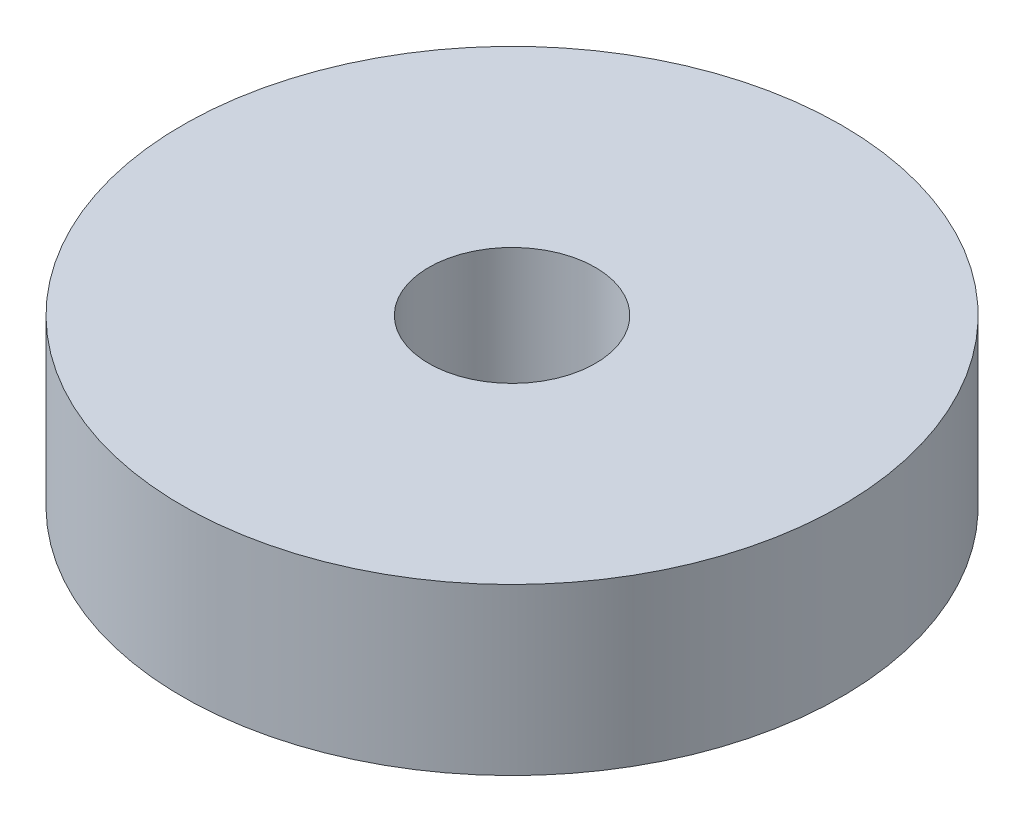
ISO-10303-21;
HEADER;
FILE_DESCRIPTION(('STEP AP214'),'2;1');
FILE_NAME('part.step','',(''),(''),'','','');
FILE_SCHEMA(('AUTOMOTIVE_DESIGN { 1 0 10303 214 1 1 1 1 }'));
ENDSEC;
DATA;
#1=APPLICATION_CONTEXT('core data for automotive mechanical design processes');
#2=APPLICATION_PROTOCOL_DEFINITION('international standard','automotive_design',2000,#1);
#3=PRODUCT_CONTEXT('',#1,'mechanical');
#4=PRODUCT('Part','Part','',(#3));
#5=PRODUCT_RELATED_PRODUCT_CATEGORY('part','',(#4));
#6=PRODUCT_DEFINITION_FORMATION('','',#4);
#7=PRODUCT_DEFINITION_CONTEXT('part definition',#1,'design');
#8=PRODUCT_DEFINITION('design','',#6,#7);
#9=PRODUCT_DEFINITION_SHAPE('','',#8);
#10=(LENGTH_UNIT() NAMED_UNIT(*) SI_UNIT(.MILLI.,.METRE.));
#11=(NAMED_UNIT(*) PLANE_ANGLE_UNIT() SI_UNIT($,.RADIAN.));
#12=(NAMED_UNIT(*) SI_UNIT($,.STERADIAN.) SOLID_ANGLE_UNIT());
#13=UNCERTAINTY_MEASURE_WITH_UNIT(LENGTH_MEASURE(1.E-05),#10,'distance_accuracy_value','');
#14=(GEOMETRIC_REPRESENTATION_CONTEXT(3) GLOBAL_UNCERTAINTY_ASSIGNED_CONTEXT((#13)) GLOBAL_UNIT_ASSIGNED_CONTEXT((#10,
#11,#12)) REPRESENTATION_CONTEXT('',''));
#15=CARTESIAN_POINT('',(0.,0.,0.));
#16=DIRECTION('',(0.,0.,1.));
#17=DIRECTION('',(1.,0.,0.));
#18=AXIS2_PLACEMENT_3D('',#15,#16,#17);
#19=CARTESIAN_POINT('',(0.,-100.,24.));
#20=DIRECTION('',(0.,-1.,0.));
#21=DIRECTION('',(0.,0.,-1.));
#22=AXIS2_PLACEMENT_3D('',#19,#20,#21);
#23=CYLINDRICAL_SURFACE('',#22,3.02);
#24=CARTESIAN_POINT('',(0.,58.5,24.));
#25=DIRECTION('',(0.,-1.,0.));
#26=DIRECTION('',(0.,0.,-1.));
#27=AXIS2_PLACEMENT_3D('',#24,#25,#26);
#28=CIRCLE('',#27,3.02);
#29=CARTESIAN_POINT('',(0.,58.5,20.98));
#30=VERTEX_POINT('',#29);
#31=EDGE_CURVE('E10',#30,#30,#28,.T.);
#32=ORIENTED_EDGE('',*,*,#31,.T.);
#33=EDGE_LOOP('',(#32));
#34=FACE_BOUND('',#33,.T.);
#35=CARTESIAN_POINT('',(0.,64.5,24.));
#36=DIRECTION('',(0.,-1.,0.));
#37=DIRECTION('',(0.,0.,-1.));
#38=AXIS2_PLACEMENT_3D('',#35,#36,#37);
#39=CIRCLE('',#38,3.02);
#40=CARTESIAN_POINT('',(0.,64.5,20.98));
#41=VERTEX_POINT('',#40);
#42=EDGE_CURVE('E52',#41,#41,#39,.T.);
#43=ORIENTED_EDGE('',*,*,#42,.F.);
#44=EDGE_LOOP('',(#43));
#45=FACE_BOUND('',#44,.T.);
#46=ADVANCED_FACE('F39',(#34,#45),#23,.F.);
#47=CARTESIAN_POINT('',(3.02,58.5,24.));
#48=DIRECTION('',(0.,-1.,0.));
#49=DIRECTION('',(0.,0.,-1.));
#50=AXIS2_PLACEMENT_3D('',#47,#48,#49);
#51=PLANE('',#50);
#52=CARTESIAN_POINT('',(0.,58.5,24.));
#53=DIRECTION('',(0.,-1.,0.));
#54=DIRECTION('',(0.,0.,-1.));
#55=AXIS2_PLACEMENT_3D('',#52,#53,#54);
#56=CIRCLE('',#55,11.95);
#57=CARTESIAN_POINT('',(0.,58.5,12.05));
#58=VERTEX_POINT('',#57);
#59=EDGE_CURVE('E44',#58,#58,#56,.T.);
#60=ORIENTED_EDGE('',*,*,#59,.T.);
#61=EDGE_LOOP('',(#60));
#62=FACE_BOUND('',#61,.T.);
#63=ORIENTED_EDGE('',*,*,#31,.F.);
#64=EDGE_LOOP('',(#63));
#65=FACE_BOUND('',#64,.T.);
#66=ADVANCED_FACE('F63',(#62,#65),#51,.T.);
#67=CARTESIAN_POINT('',(0.,-100.,24.));
#68=DIRECTION('',(0.,-1.,0.));
#69=DIRECTION('',(0.,0.,-1.));
#70=AXIS2_PLACEMENT_3D('',#67,#68,#69);
#71=CYLINDRICAL_SURFACE('',#70,11.95);
#72=CARTESIAN_POINT('',(0.,64.5,24.));
#73=DIRECTION('',(0.,-1.,0.));
#74=DIRECTION('',(0.,0.,-1.));
#75=AXIS2_PLACEMENT_3D('',#72,#73,#74);
#76=CIRCLE('',#75,11.95);
#77=CARTESIAN_POINT('',(0.,64.5,12.05));
#78=VERTEX_POINT('',#77);
#79=EDGE_CURVE('E47',#78,#78,#76,.T.);
#80=ORIENTED_EDGE('',*,*,#79,.T.);
#81=EDGE_LOOP('',(#80));
#82=FACE_BOUND('',#81,.T.);
#83=ORIENTED_EDGE('',*,*,#59,.F.);
#84=EDGE_LOOP('',(#83));
#85=FACE_BOUND('',#84,.T.);
#86=ADVANCED_FACE('F70',(#82,#85),#71,.T.);
#87=CARTESIAN_POINT('',(11.95,64.5,24.));
#88=DIRECTION('',(0.,1.,0.));
#89=DIRECTION('',(0.,0.,1.));
#90=AXIS2_PLACEMENT_3D('',#87,#88,#89);
#91=PLANE('',#90);
#92=ORIENTED_EDGE('',*,*,#42,.T.);
#93=EDGE_LOOP('',(#92));
#94=FACE_BOUND('',#93,.T.);
#95=ORIENTED_EDGE('',*,*,#79,.F.);
#96=EDGE_LOOP('',(#95));
#97=FACE_BOUND('',#96,.T.);
#98=ADVANCED_FACE('F56',(#94,#97),#91,.T.);
#99=CLOSED_SHELL('',(#46,#66,#86,#98));
#100=MANIFOLD_SOLID_BREP('B2',#99);
#101=ADVANCED_BREP_SHAPE_REPRESENTATION('',(#18,#100),#14);
#102=SHAPE_DEFINITION_REPRESENTATION(#9,#101);
ENDSEC;
END-ISO-10303-21;
